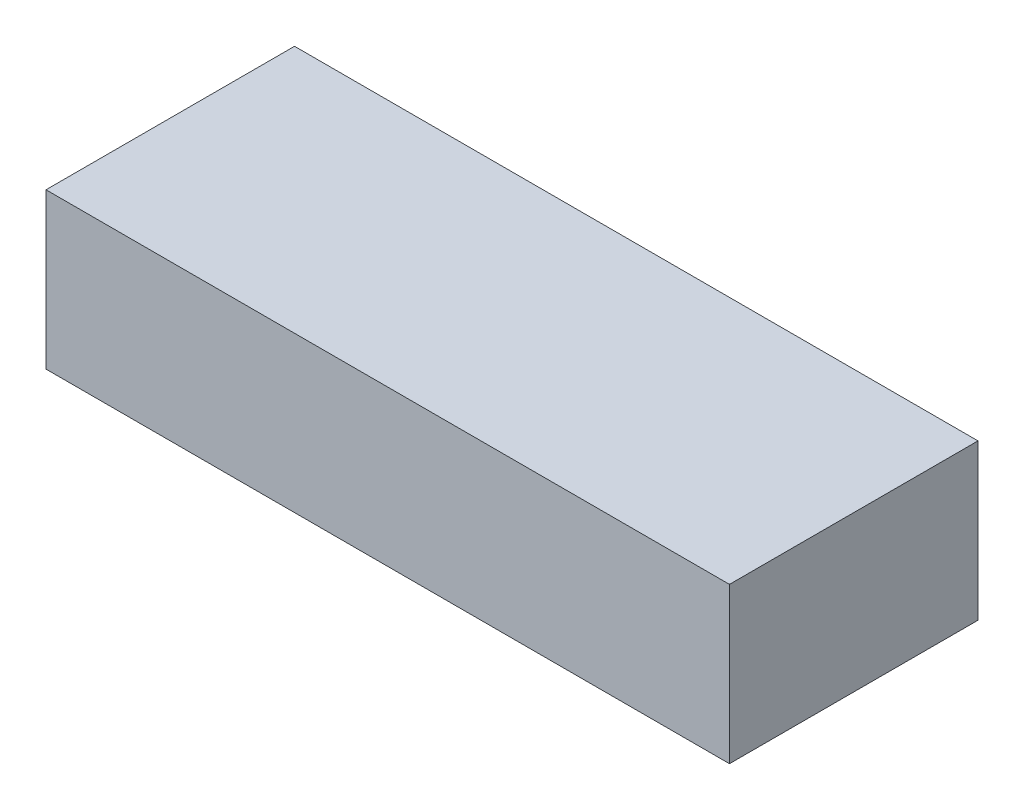
ISO-10303-21;
HEADER;
FILE_DESCRIPTION(('STEP AP214'),'2;1');
FILE_NAME('part.step','',(''),(''),'','','');
FILE_SCHEMA(('AUTOMOTIVE_DESIGN { 1 0 10303 214 1 1 1 1 }'));
ENDSEC;
DATA;
#1=APPLICATION_CONTEXT('core data for automotive mechanical design processes');
#2=APPLICATION_PROTOCOL_DEFINITION('international standard','automotive_design',2000,#1);
#3=PRODUCT_CONTEXT('',#1,'mechanical');
#4=PRODUCT('Part','Part','',(#3));
#5=PRODUCT_RELATED_PRODUCT_CATEGORY('part','',(#4));
#6=PRODUCT_DEFINITION_FORMATION('','',#4);
#7=PRODUCT_DEFINITION_CONTEXT('part definition',#1,'design');
#8=PRODUCT_DEFINITION('design','',#6,#7);
#9=PRODUCT_DEFINITION_SHAPE('','',#8);
#10=(LENGTH_UNIT() NAMED_UNIT(*) SI_UNIT(.MILLI.,.METRE.));
#11=(NAMED_UNIT(*) PLANE_ANGLE_UNIT() SI_UNIT($,.RADIAN.));
#12=(NAMED_UNIT(*) SI_UNIT($,.STERADIAN.) SOLID_ANGLE_UNIT());
#13=UNCERTAINTY_MEASURE_WITH_UNIT(LENGTH_MEASURE(1.E-05),#10,'distance_accuracy_value','');
#14=(GEOMETRIC_REPRESENTATION_CONTEXT(3) GLOBAL_UNCERTAINTY_ASSIGNED_CONTEXT((#13)) GLOBAL_UNIT_ASSIGNED_CONTEXT((#10,
#11,#12)) REPRESENTATION_CONTEXT('',''));
#15=CARTESIAN_POINT('',(0.,0.,0.));
#16=DIRECTION('',(0.,0.,1.));
#17=DIRECTION('',(1.,0.,0.));
#18=AXIS2_PLACEMENT_3D('',#15,#16,#17);
#19=CARTESIAN_POINT('',(34.925,-7.9375,25.4));
#20=DIRECTION('',(-1.,0.,0.));
#21=DIRECTION('',(0.,0.,1.));
#22=AXIS2_PLACEMENT_3D('',#19,#20,#21);
#23=PLANE('',#22);
#24=DIRECTION('',(0.,1.,0.));
#25=VECTOR('',#24,1.);
#26=CARTESIAN_POINT('',(34.925,-7.9375,0.));
#27=LINE('',#26,#25);
#28=CARTESIAN_POINT('',(34.925,-7.9375,0.));
#29=VERTEX_POINT('',#28);
#30=CARTESIAN_POINT('',(34.925,7.9375,0.));
#31=VERTEX_POINT('',#30);
#32=EDGE_CURVE('E100',#29,#31,#27,.T.);
#33=ORIENTED_EDGE('',*,*,#32,.T.);
#34=DIRECTION('',(0.,0.,-1.));
#35=VECTOR('',#34,1.);
#36=CARTESIAN_POINT('',(34.925,7.9375,25.4));
#37=LINE('',#36,#35);
#38=CARTESIAN_POINT('',(34.925,7.9375,25.4));
#39=VERTEX_POINT('',#38);
#40=EDGE_CURVE('E11',#39,#31,#37,.T.);
#41=ORIENTED_EDGE('',*,*,#40,.F.);
#42=DIRECTION('',(0.,1.,0.));
#43=VECTOR('',#42,1.);
#44=CARTESIAN_POINT('',(34.925,-7.9375,25.4));
#45=LINE('',#44,#43);
#46=CARTESIAN_POINT('',(34.925,-7.9375,25.4));
#47=VERTEX_POINT('',#46);
#48=EDGE_CURVE('E88',#47,#39,#45,.T.);
#49=ORIENTED_EDGE('',*,*,#48,.F.);
#50=DIRECTION('',(0.,0.,-1.));
#51=VECTOR('',#50,1.);
#52=CARTESIAN_POINT('',(34.925,-7.9375,25.4));
#53=LINE('',#52,#51);
#54=EDGE_CURVE('E96',#47,#29,#53,.T.);
#55=ORIENTED_EDGE('',*,*,#54,.T.);
#56=EDGE_LOOP('',(#33,#41,#49,#55));
#57=FACE_BOUND('',#56,.T.);
#58=ADVANCED_FACE('F37',(#57),#23,.F.);
#59=CARTESIAN_POINT('',(-34.925,7.9375,25.4));
#60=DIRECTION('',(0.,-1.,0.));
#61=DIRECTION('',(0.,0.,-1.));
#62=AXIS2_PLACEMENT_3D('',#59,#60,#61);
#63=PLANE('',#62);
#64=DIRECTION('',(-1.,0.,0.));
#65=VECTOR('',#64,1.);
#66=CARTESIAN_POINT('',(-34.925,7.9375,0.));
#67=LINE('',#66,#65);
#68=CARTESIAN_POINT('',(-34.925,7.9375,0.));
#69=VERTEX_POINT('',#68);
#70=EDGE_CURVE('E92',#31,#69,#67,.T.);
#71=ORIENTED_EDGE('',*,*,#70,.T.);
#72=DIRECTION('',(0.,0.,-1.));
#73=VECTOR('',#72,1.);
#74=CARTESIAN_POINT('',(-34.925,7.9375,25.4));
#75=LINE('',#74,#73);
#76=CARTESIAN_POINT('',(-34.925,7.9375,25.4));
#77=VERTEX_POINT('',#76);
#78=EDGE_CURVE('E45',#77,#69,#75,.T.);
#79=ORIENTED_EDGE('',*,*,#78,.F.);
#80=DIRECTION('',(-1.,0.,0.));
#81=VECTOR('',#80,1.);
#82=CARTESIAN_POINT('',(-34.925,7.9375,25.4));
#83=LINE('',#82,#81);
#84=EDGE_CURVE('E83',#39,#77,#83,.T.);
#85=ORIENTED_EDGE('',*,*,#84,.F.);
#86=ORIENTED_EDGE('',*,*,#40,.T.);
#87=EDGE_LOOP('',(#71,#79,#85,#86));
#88=FACE_BOUND('',#87,.T.);
#89=ADVANCED_FACE('F91',(#88),#63,.F.);
#90=CARTESIAN_POINT('',(-34.925,-7.9375,25.4));
#91=DIRECTION('',(1.,0.,0.));
#92=DIRECTION('',(0.,0.,-1.));
#93=AXIS2_PLACEMENT_3D('',#90,#91,#92);
#94=PLANE('',#93);
#95=DIRECTION('',(0.,-1.,0.));
#96=VECTOR('',#95,1.);
#97=CARTESIAN_POINT('',(-34.925,-7.9375,0.));
#98=LINE('',#97,#96);
#99=CARTESIAN_POINT('',(-34.925,-7.9375,0.));
#100=VERTEX_POINT('',#99);
#101=EDGE_CURVE('E70',#69,#100,#98,.T.);
#102=ORIENTED_EDGE('',*,*,#101,.T.);
#103=DIRECTION('',(0.,0.,-1.));
#104=VECTOR('',#103,1.);
#105=CARTESIAN_POINT('',(-34.925,-7.9375,25.4));
#106=LINE('',#105,#104);
#107=CARTESIAN_POINT('',(-34.925,-7.9375,25.4));
#108=VERTEX_POINT('',#107);
#109=EDGE_CURVE('E93',#108,#100,#106,.T.);
#110=ORIENTED_EDGE('',*,*,#109,.F.);
#111=DIRECTION('',(0.,-1.,0.));
#112=VECTOR('',#111,1.);
#113=CARTESIAN_POINT('',(-34.925,-7.9375,25.4));
#114=LINE('',#113,#112);
#115=EDGE_CURVE('E86',#77,#108,#114,.T.);
#116=ORIENTED_EDGE('',*,*,#115,.F.);
#117=ORIENTED_EDGE('',*,*,#78,.T.);
#118=EDGE_LOOP('',(#102,#110,#116,#117));
#119=FACE_BOUND('',#118,.T.);
#120=ADVANCED_FACE('F94',(#119),#94,.F.);
#121=CARTESIAN_POINT('',(-34.925,-7.9375,25.4));
#122=DIRECTION('',(0.,1.,0.));
#123=DIRECTION('',(0.,0.,1.));
#124=AXIS2_PLACEMENT_3D('',#121,#122,#123);
#125=PLANE('',#124);
#126=DIRECTION('',(1.,0.,0.));
#127=VECTOR('',#126,1.);
#128=CARTESIAN_POINT('',(-34.925,-7.9375,0.));
#129=LINE('',#128,#127);
#130=EDGE_CURVE('E76',#100,#29,#129,.T.);
#131=ORIENTED_EDGE('',*,*,#130,.T.);
#132=ORIENTED_EDGE('',*,*,#54,.F.);
#133=DIRECTION('',(1.,0.,0.));
#134=VECTOR('',#133,1.);
#135=CARTESIAN_POINT('',(-34.925,-7.9375,25.4));
#136=LINE('',#135,#134);
#137=EDGE_CURVE('E53',#108,#47,#136,.T.);
#138=ORIENTED_EDGE('',*,*,#137,.F.);
#139=ORIENTED_EDGE('',*,*,#109,.T.);
#140=EDGE_LOOP('',(#131,#132,#138,#139));
#141=FACE_BOUND('',#140,.T.);
#142=ADVANCED_FACE('F107',(#141),#125,.F.);
#143=CARTESIAN_POINT('',(0.,0.,25.4));
#144=DIRECTION('',(0.,0.,-1.));
#145=DIRECTION('',(-1.,0.,0.));
#146=AXIS2_PLACEMENT_3D('',#143,#144,#145);
#147=PLANE('',#146);
#148=ORIENTED_EDGE('',*,*,#48,.T.);
#149=ORIENTED_EDGE('',*,*,#84,.T.);
#150=ORIENTED_EDGE('',*,*,#115,.T.);
#151=ORIENTED_EDGE('',*,*,#137,.T.);
#152=EDGE_LOOP('',(#148,#149,#150,#151));
#153=FACE_BOUND('',#152,.T.);
#154=ADVANCED_FACE('F84',(#153),#147,.F.);
#155=CARTESIAN_POINT('',(0.,0.,0.));
#156=DIRECTION('',(0.,0.,-1.));
#157=DIRECTION('',(-1.,0.,0.));
#158=AXIS2_PLACEMENT_3D('',#155,#156,#157);
#159=PLANE('',#158);
#160=ORIENTED_EDGE('',*,*,#32,.F.);
#161=ORIENTED_EDGE('',*,*,#130,.F.);
#162=ORIENTED_EDGE('',*,*,#101,.F.);
#163=ORIENTED_EDGE('',*,*,#70,.F.);
#164=EDGE_LOOP('',(#160,#161,#162,#163));
#165=FACE_BOUND('',#164,.T.);
#166=ADVANCED_FACE('F110',(#165),#159,.T.);
#167=CLOSED_SHELL('',(#58,#89,#120,#142,#154,#166));
#168=MANIFOLD_SOLID_BREP('B2',#167);
#169=ADVANCED_BREP_SHAPE_REPRESENTATION('',(#18,#168),#14);
#170=SHAPE_DEFINITION_REPRESENTATION(#9,#169);
ENDSEC;
END-ISO-10303-21;
